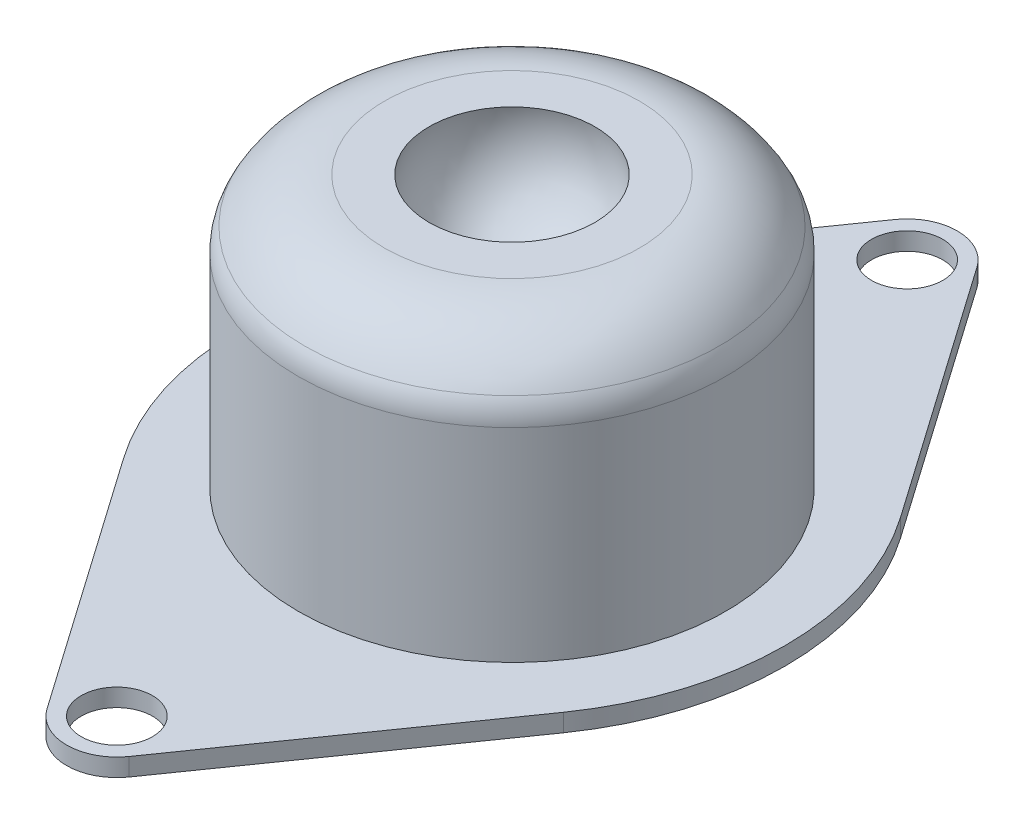
ISO-10303-21;
HEADER;
FILE_DESCRIPTION(('STEP AP214'),'2;1');
FILE_NAME('part.step','',(''),(''),'','','');
FILE_SCHEMA(('AUTOMOTIVE_DESIGN { 1 0 10303 214 1 1 1 1 }'));
ENDSEC;
DATA;
#1=APPLICATION_CONTEXT('core data for automotive mechanical design processes');
#2=APPLICATION_PROTOCOL_DEFINITION('international standard','automotive_design',2000,#1);
#3=PRODUCT_CONTEXT('',#1,'mechanical');
#4=PRODUCT('Part','Part','',(#3));
#5=PRODUCT_RELATED_PRODUCT_CATEGORY('part','',(#4));
#6=PRODUCT_DEFINITION_FORMATION('','',#4);
#7=PRODUCT_DEFINITION_CONTEXT('part definition',#1,'design');
#8=PRODUCT_DEFINITION('design','',#6,#7);
#9=PRODUCT_DEFINITION_SHAPE('','',#8);
#10=(LENGTH_UNIT() NAMED_UNIT(*) SI_UNIT(.MILLI.,.METRE.));
#11=(NAMED_UNIT(*) PLANE_ANGLE_UNIT() SI_UNIT($,.RADIAN.));
#12=(NAMED_UNIT(*) SI_UNIT($,.STERADIAN.) SOLID_ANGLE_UNIT());
#13=UNCERTAINTY_MEASURE_WITH_UNIT(LENGTH_MEASURE(1.E-05),#10,'distance_accuracy_value','');
#14=(GEOMETRIC_REPRESENTATION_CONTEXT(3) GLOBAL_UNCERTAINTY_ASSIGNED_CONTEXT((#13)) GLOBAL_UNIT_ASSIGNED_CONTEXT((#10,
#11,#12)) REPRESENTATION_CONTEXT('',''));
#15=CARTESIAN_POINT('',(0.,0.,0.));
#16=DIRECTION('',(0.,0.,1.));
#17=DIRECTION('',(1.,0.,0.));
#18=AXIS2_PLACEMENT_3D('',#15,#16,#17);
#19=CARTESIAN_POINT('',(0.,1.,-22.1839548103891));
#20=DIRECTION('',(0.,-1.,0.));
#21=DIRECTION('',(0.,0.,-1.));
#22=AXIS2_PLACEMENT_3D('',#19,#20,#21);
#23=CYLINDRICAL_SURFACE('',#22,2.81604518961093);
#24=CARTESIAN_POINT('',(0.,0.,-22.1839548103891));
#25=DIRECTION('',(0.,1.,0.));
#26=DIRECTION('',(0.,0.,-1.));
#27=AXIS2_PLACEMENT_3D('',#24,#25,#26);
#28=CIRCLE('',#27,2.81604518961093);
#29=CARTESIAN_POINT('',(2.30676917387997,0.,-23.7991719748496));
#30=VERTEX_POINT('',#29);
#31=CARTESIAN_POINT('',(-2.30676917387997,0.,-23.7991719748496));
#32=VERTEX_POINT('',#31);
#33=EDGE_CURVE('E131',#30,#32,#28,.T.);
#34=ORIENTED_EDGE('',*,*,#33,.T.);
#35=DIRECTION('',(0.,-1.,0.));
#36=VECTOR('',#35,1.);
#37=CARTESIAN_POINT('',(-2.30676917387997,1.,-23.7991719748496));
#38=LINE('',#37,#36);
#39=CARTESIAN_POINT('',(-2.30676917387997,1.,-23.7991719748496));
#40=VERTEX_POINT('',#39);
#41=EDGE_CURVE('E159',#40,#32,#38,.T.);
#42=ORIENTED_EDGE('',*,*,#41,.F.);
#43=CARTESIAN_POINT('',(0.,1.,-22.1839548103891));
#44=DIRECTION('',(0.,1.,0.));
#45=DIRECTION('',(0.,0.,-1.));
#46=AXIS2_PLACEMENT_3D('',#43,#44,#45);
#47=CIRCLE('',#46,2.81604518961093);
#48=CARTESIAN_POINT('',(2.30676917387997,1.,-23.7991719748496));
#49=VERTEX_POINT('',#48);
#50=EDGE_CURVE('E146',#49,#40,#47,.T.);
#51=ORIENTED_EDGE('',*,*,#50,.F.);
#52=DIRECTION('',(0.,-1.,0.));
#53=VECTOR('',#52,1.);
#54=CARTESIAN_POINT('',(2.30676917387997,1.,-23.7991719748496));
#55=LINE('',#54,#53);
#56=EDGE_CURVE('E127',#49,#30,#55,.T.);
#57=ORIENTED_EDGE('',*,*,#56,.T.);
#58=EDGE_LOOP('',(#34,#42,#51,#57));
#59=FACE_BOUND('',#58,.T.);
#60=ADVANCED_FACE('F33',(#59),#23,.T.);
#61=CARTESIAN_POINT('',(-2.30676917387997,1.,-23.7991719748496));
#62=DIRECTION('',(0.819152044288991,0.,0.573576436351047));
#63=DIRECTION('',(0.573576436351047,0.,-0.819152044288991));
#64=AXIS2_PLACEMENT_3D('',#61,#62,#63);
#65=PLANE('',#64);
#66=DIRECTION('',(-0.573576436351047,0.,0.819152044288991));
#67=VECTOR('',#66,1.);
#68=CARTESIAN_POINT('',(-2.30676917387997,0.,-23.7991719748496));
#69=LINE('',#68,#67);
#70=CARTESIAN_POINT('',(-12.3443568100233,0.,-9.46401119979229));
#71=VERTEX_POINT('',#70);
#72=EDGE_CURVE('E134',#32,#71,#69,.T.);
#73=ORIENTED_EDGE('',*,*,#72,.T.);
#74=DIRECTION('',(0.,-1.,0.));
#75=VECTOR('',#74,1.);
#76=CARTESIAN_POINT('',(-12.3443568100233,1.,-9.46401119979229));
#77=LINE('',#76,#75);
#78=CARTESIAN_POINT('',(-12.3443568100233,1.,-9.46401119979229));
#79=VERTEX_POINT('',#78);
#80=EDGE_CURVE('E156',#79,#71,#77,.T.);
#81=ORIENTED_EDGE('',*,*,#80,.F.);
#82=DIRECTION('',(-0.573576436351047,0.,0.819152044288991));
#83=VECTOR('',#82,1.);
#84=CARTESIAN_POINT('',(-2.30676917387997,1.,-23.7991719748496));
#85=LINE('',#84,#83);
#86=EDGE_CURVE('E94',#40,#79,#85,.T.);
#87=ORIENTED_EDGE('',*,*,#86,.F.);
#88=ORIENTED_EDGE('',*,*,#41,.T.);
#89=EDGE_LOOP('',(#73,#81,#87,#88));
#90=FACE_BOUND('',#89,.T.);
#91=ADVANCED_FACE('F212',(#90),#65,.F.);
#92=CARTESIAN_POINT('',(1.17165192074506,1.,0.));
#93=DIRECTION('',(0.,-1.,0.));
#94=DIRECTION('',(0.,0.,-1.));
#95=AXIS2_PLACEMENT_3D('',#92,#93,#94);
#96=CYLINDRICAL_SURFACE('',#95,16.5);
#97=CARTESIAN_POINT('',(1.17165192074506,0.,0.));
#98=DIRECTION('',(0.,1.,0.));
#99=DIRECTION('',(0.,0.,1.));
#100=AXIS2_PLACEMENT_3D('',#97,#98,#99);
#101=CIRCLE('',#100,16.5);
#102=CARTESIAN_POINT('',(-12.3443568100233,0.,9.46401119979227));
#103=VERTEX_POINT('',#102);
#104=EDGE_CURVE('E137',#71,#103,#101,.T.);
#105=ORIENTED_EDGE('',*,*,#104,.T.);
#106=DIRECTION('',(0.,-1.,0.));
#107=VECTOR('',#106,1.);
#108=CARTESIAN_POINT('',(-12.3443568100233,1.,9.46401119979227));
#109=LINE('',#108,#107);
#110=CARTESIAN_POINT('',(-12.3443568100233,1.,9.46401119979227));
#111=VERTEX_POINT('',#110);
#112=EDGE_CURVE('E153',#111,#103,#109,.T.);
#113=ORIENTED_EDGE('',*,*,#112,.F.);
#114=CARTESIAN_POINT('',(1.17165192074506,1.,0.));
#115=DIRECTION('',(0.,1.,0.));
#116=DIRECTION('',(0.,0.,1.));
#117=AXIS2_PLACEMENT_3D('',#114,#115,#116);
#118=CIRCLE('',#117,16.5);
#119=EDGE_CURVE('E180',#79,#111,#118,.T.);
#120=ORIENTED_EDGE('',*,*,#119,.F.);
#121=ORIENTED_EDGE('',*,*,#80,.T.);
#122=EDGE_LOOP('',(#105,#113,#120,#121));
#123=FACE_BOUND('',#122,.T.);
#124=ADVANCED_FACE('F216',(#123),#96,.T.);
#125=CARTESIAN_POINT('',(-2.30676917387997,1.,23.7991719748496));
#126=DIRECTION('',(0.819152044288991,0.,-0.573576436351047));
#127=DIRECTION('',(-0.573576436351047,0.,-0.819152044288991));
#128=AXIS2_PLACEMENT_3D('',#125,#126,#127);
#129=PLANE('',#128);
#130=DIRECTION('',(0.573576436351047,0.,0.819152044288991));
#131=VECTOR('',#130,1.);
#132=CARTESIAN_POINT('',(-2.30676917387997,0.,23.7991719748496));
#133=LINE('',#132,#131);
#134=CARTESIAN_POINT('',(-2.30676917387997,0.,23.7991719748496));
#135=VERTEX_POINT('',#134);
#136=EDGE_CURVE('E139',#103,#135,#133,.T.);
#137=ORIENTED_EDGE('',*,*,#136,.T.);
#138=DIRECTION('',(0.,-1.,0.));
#139=VECTOR('',#138,1.);
#140=CARTESIAN_POINT('',(-2.30676917387997,1.,23.7991719748496));
#141=LINE('',#140,#139);
#142=CARTESIAN_POINT('',(-2.30676917387997,1.,23.7991719748496));
#143=VERTEX_POINT('',#142);
#144=EDGE_CURVE('E150',#143,#135,#141,.T.);
#145=ORIENTED_EDGE('',*,*,#144,.F.);
#146=DIRECTION('',(0.573576436351047,0.,0.819152044288991));
#147=VECTOR('',#146,1.);
#148=CARTESIAN_POINT('',(-2.30676917387997,1.,23.7991719748496));
#149=LINE('',#148,#147);
#150=EDGE_CURVE('E182',#111,#143,#149,.T.);
#151=ORIENTED_EDGE('',*,*,#150,.F.);
#152=ORIENTED_EDGE('',*,*,#112,.T.);
#153=EDGE_LOOP('',(#137,#145,#151,#152));
#154=FACE_BOUND('',#153,.T.);
#155=ADVANCED_FACE('F188',(#154),#129,.F.);
#156=CARTESIAN_POINT('',(0.,1.,22.1839548103891));
#157=DIRECTION('',(0.,-1.,0.));
#158=DIRECTION('',(0.,0.,-1.));
#159=AXIS2_PLACEMENT_3D('',#156,#157,#158);
#160=CYLINDRICAL_SURFACE('',#159,2.81604518961093);
#161=CARTESIAN_POINT('',(0.,0.,22.1839548103891));
#162=DIRECTION('',(0.,1.,0.));
#163=DIRECTION('',(0.,0.,1.));
#164=AXIS2_PLACEMENT_3D('',#161,#162,#163);
#165=CIRCLE('',#164,2.81604518961093);
#166=CARTESIAN_POINT('',(2.30676917387997,0.,23.7991719748496));
#167=VERTEX_POINT('',#166);
#168=EDGE_CURVE('E141',#135,#167,#165,.T.);
#169=ORIENTED_EDGE('',*,*,#168,.T.);
#170=DIRECTION('',(0.,-1.,0.));
#171=VECTOR('',#170,1.);
#172=CARTESIAN_POINT('',(2.30676917387997,1.,23.7991719748496));
#173=LINE('',#172,#171);
#174=CARTESIAN_POINT('',(2.30676917387997,1.,23.7991719748496));
#175=VERTEX_POINT('',#174);
#176=EDGE_CURVE('E122',#175,#167,#173,.T.);
#177=ORIENTED_EDGE('',*,*,#176,.F.);
#178=CARTESIAN_POINT('',(0.,1.,22.1839548103891));
#179=DIRECTION('',(0.,1.,0.));
#180=DIRECTION('',(0.,0.,1.));
#181=AXIS2_PLACEMENT_3D('',#178,#179,#180);
#182=CIRCLE('',#181,2.81604518961093);
#183=EDGE_CURVE('E113',#143,#175,#182,.T.);
#184=ORIENTED_EDGE('',*,*,#183,.F.);
#185=ORIENTED_EDGE('',*,*,#144,.T.);
#186=EDGE_LOOP('',(#169,#177,#184,#185));
#187=FACE_BOUND('',#186,.T.);
#188=ADVANCED_FACE('F192',(#187),#160,.T.);
#189=CARTESIAN_POINT('',(2.30676917387998,1.,23.7991719748496));
#190=DIRECTION('',(-0.819152044288992,0.,-0.573576436351047));
#191=DIRECTION('',(-0.573576436351047,0.,0.819152044288992));
#192=AXIS2_PLACEMENT_3D('',#189,#190,#191);
#193=PLANE('',#192);
#194=DIRECTION('',(0.573576436351047,0.,-0.819152044288992));
#195=VECTOR('',#194,1.);
#196=CARTESIAN_POINT('',(2.30676917387998,0.,23.7991719748496));
#197=LINE('',#196,#195);
#198=CARTESIAN_POINT('',(12.3443568100233,0.,9.46401119979227));
#199=VERTEX_POINT('',#198);
#200=EDGE_CURVE('E121',#167,#199,#197,.T.);
#201=ORIENTED_EDGE('',*,*,#200,.T.);
#202=DIRECTION('',(0.,-1.,0.));
#203=VECTOR('',#202,1.);
#204=CARTESIAN_POINT('',(12.3443568100233,1.,9.46401119979227));
#205=LINE('',#204,#203);
#206=CARTESIAN_POINT('',(12.3443568100233,1.,9.46401119979227));
#207=VERTEX_POINT('',#206);
#208=EDGE_CURVE('E118',#207,#199,#205,.T.);
#209=ORIENTED_EDGE('',*,*,#208,.F.);
#210=DIRECTION('',(0.573576436351047,0.,-0.819152044288992));
#211=VECTOR('',#210,1.);
#212=CARTESIAN_POINT('',(2.30676917387998,1.,23.7991719748496));
#213=LINE('',#212,#211);
#214=EDGE_CURVE('E107',#175,#207,#213,.T.);
#215=ORIENTED_EDGE('',*,*,#214,.F.);
#216=ORIENTED_EDGE('',*,*,#176,.T.);
#217=EDGE_LOOP('',(#201,#209,#215,#216));
#218=FACE_BOUND('',#217,.T.);
#219=ADVANCED_FACE('F119',(#218),#193,.F.);
#220=CARTESIAN_POINT('',(-1.17165192074505,1.,0.));
#221=DIRECTION('',(0.,-1.,0.));
#222=DIRECTION('',(0.,0.,-1.));
#223=AXIS2_PLACEMENT_3D('',#220,#221,#222);
#224=CYLINDRICAL_SURFACE('',#223,16.5);
#225=CARTESIAN_POINT('',(-1.17165192074505,0.,0.));
#226=DIRECTION('',(0.,1.,0.));
#227=DIRECTION('',(0.,0.,-1.));
#228=AXIS2_PLACEMENT_3D('',#225,#226,#227);
#229=CIRCLE('',#228,16.5);
#230=CARTESIAN_POINT('',(12.3443568100233,0.,-9.46401119979229));
#231=VERTEX_POINT('',#230);
#232=EDGE_CURVE('E79',#199,#231,#229,.T.);
#233=ORIENTED_EDGE('',*,*,#232,.T.);
#234=DIRECTION('',(0.,-1.,0.));
#235=VECTOR('',#234,1.);
#236=CARTESIAN_POINT('',(12.3443568100233,1.,-9.46401119979229));
#237=LINE('',#236,#235);
#238=CARTESIAN_POINT('',(12.3443568100233,1.,-9.46401119979229));
#239=VERTEX_POINT('',#238);
#240=EDGE_CURVE('E123',#239,#231,#237,.T.);
#241=ORIENTED_EDGE('',*,*,#240,.F.);
#242=CARTESIAN_POINT('',(-1.17165192074505,1.,0.));
#243=DIRECTION('',(0.,1.,0.));
#244=DIRECTION('',(0.,0.,-1.));
#245=AXIS2_PLACEMENT_3D('',#242,#243,#244);
#246=CIRCLE('',#245,16.5);
#247=EDGE_CURVE('E111',#207,#239,#246,.T.);
#248=ORIENTED_EDGE('',*,*,#247,.F.);
#249=ORIENTED_EDGE('',*,*,#208,.T.);
#250=EDGE_LOOP('',(#233,#241,#248,#249));
#251=FACE_BOUND('',#250,.T.);
#252=ADVANCED_FACE('F125',(#251),#224,.T.);
#253=CARTESIAN_POINT('',(2.30676917387997,1.,-23.7991719748496));
#254=DIRECTION('',(-0.819152044288991,0.,0.573576436351047));
#255=DIRECTION('',(0.573576436351047,0.,0.819152044288991));
#256=AXIS2_PLACEMENT_3D('',#253,#254,#255);
#257=PLANE('',#256);
#258=DIRECTION('',(-0.573576436351047,0.,-0.819152044288991));
#259=VECTOR('',#258,1.);
#260=CARTESIAN_POINT('',(2.30676917387997,0.,-23.7991719748496));
#261=LINE('',#260,#259);
#262=EDGE_CURVE('E85',#231,#30,#261,.T.);
#263=ORIENTED_EDGE('',*,*,#262,.T.);
#264=ORIENTED_EDGE('',*,*,#56,.F.);
#265=DIRECTION('',(-0.573576436351047,0.,-0.819152044288991));
#266=VECTOR('',#265,1.);
#267=CARTESIAN_POINT('',(2.30676917387997,1.,-23.7991719748496));
#268=LINE('',#267,#266);
#269=EDGE_CURVE('E50',#239,#49,#268,.T.);
#270=ORIENTED_EDGE('',*,*,#269,.F.);
#271=ORIENTED_EDGE('',*,*,#240,.T.);
#272=EDGE_LOOP('',(#263,#264,#270,#271));
#273=FACE_BOUND('',#272,.T.);
#274=ADVANCED_FACE('F200',(#273),#257,.F.);
#275=CARTESIAN_POINT('',(0.,1.,-22.1839548103891));
#276=DIRECTION('',(0.,-1.,0.));
#277=DIRECTION('',(0.,0.,-1.));
#278=AXIS2_PLACEMENT_3D('',#275,#276,#277);
#279=PLANE('',#278);
#280=CARTESIAN_POINT('',(0.,1.,22.1839548103891));
#281=DIRECTION('',(0.,1.,0.));
#282=DIRECTION('',(0.,0.,1.));
#283=AXIS2_PLACEMENT_3D('',#280,#281,#282);
#284=CIRCLE('',#283,2.);
#285=CARTESIAN_POINT('',(0.,1.,24.1839548103891));
#286=VERTEX_POINT('',#285);
#287=EDGE_CURVE('E329',#286,#286,#284,.T.);
#288=ORIENTED_EDGE('',*,*,#287,.F.);
#289=EDGE_LOOP('',(#288));
#290=FACE_BOUND('',#289,.T.);
#291=CARTESIAN_POINT('',(0.,1.,-22.1839548103891));
#292=DIRECTION('',(0.,1.,0.));
#293=DIRECTION('',(0.,0.,1.));
#294=AXIS2_PLACEMENT_3D('',#291,#292,#293);
#295=CIRCLE('',#294,2.);
#296=CARTESIAN_POINT('',(0.,1.,-20.1839548103891));
#297=VERTEX_POINT('',#296);
#298=EDGE_CURVE('E170',#297,#297,#295,.T.);
#299=ORIENTED_EDGE('',*,*,#298,.F.);
#300=EDGE_LOOP('',(#299));
#301=FACE_BOUND('',#300,.T.);
#302=CARTESIAN_POINT('',(0.,1.,0.));
#303=DIRECTION('',(0.,1.,0.));
#304=DIRECTION('',(0.,0.,1.));
#305=AXIS2_PLACEMENT_3D('',#302,#303,#304);
#306=CIRCLE('',#305,12.);
#307=CARTESIAN_POINT('',(0.,1.,12.));
#308=VERTEX_POINT('',#307);
#309=EDGE_CURVE('E160',#308,#308,#306,.T.);
#310=ORIENTED_EDGE('',*,*,#309,.F.);
#311=EDGE_LOOP('',(#310));
#312=FACE_BOUND('',#311,.T.);
#313=ORIENTED_EDGE('',*,*,#50,.T.);
#314=ORIENTED_EDGE('',*,*,#86,.T.);
#315=ORIENTED_EDGE('',*,*,#119,.T.);
#316=ORIENTED_EDGE('',*,*,#150,.T.);
#317=ORIENTED_EDGE('',*,*,#183,.T.);
#318=ORIENTED_EDGE('',*,*,#214,.T.);
#319=ORIENTED_EDGE('',*,*,#247,.T.);
#320=ORIENTED_EDGE('',*,*,#269,.T.);
#321=EDGE_LOOP('',(#313,#314,#315,#316,#317,#318,#319,#320));
#322=FACE_BOUND('',#321,.T.);
#323=ADVANCED_FACE('F109',(#290,#301,#312,#322),#279,.F.);
#324=CARTESIAN_POINT('',(0.,0.,-22.1839548103891));
#325=DIRECTION('',(0.,-1.,0.));
#326=DIRECTION('',(0.,0.,-1.));
#327=AXIS2_PLACEMENT_3D('',#324,#325,#326);
#328=PLANE('',#327);
#329=CARTESIAN_POINT('',(0.,0.,22.1839548103891));
#330=DIRECTION('',(0.,1.,0.));
#331=DIRECTION('',(0.,0.,1.));
#332=AXIS2_PLACEMENT_3D('',#329,#330,#331);
#333=CIRCLE('',#332,2.);
#334=CARTESIAN_POINT('',(0.,0.,24.1839548103891));
#335=VERTEX_POINT('',#334);
#336=EDGE_CURVE('E175',#335,#335,#333,.T.);
#337=ORIENTED_EDGE('',*,*,#336,.T.);
#338=EDGE_LOOP('',(#337));
#339=FACE_BOUND('',#338,.T.);
#340=CARTESIAN_POINT('',(0.,0.,-22.1839548103891));
#341=DIRECTION('',(0.,1.,0.));
#342=DIRECTION('',(0.,0.,1.));
#343=AXIS2_PLACEMENT_3D('',#340,#341,#342);
#344=CIRCLE('',#343,2.);
#345=CARTESIAN_POINT('',(0.,0.,-20.1839548103891));
#346=VERTEX_POINT('',#345);
#347=EDGE_CURVE('E330',#346,#346,#344,.T.);
#348=ORIENTED_EDGE('',*,*,#347,.T.);
#349=EDGE_LOOP('',(#348));
#350=FACE_BOUND('',#349,.T.);
#351=ORIENTED_EDGE('',*,*,#33,.F.);
#352=ORIENTED_EDGE('',*,*,#262,.F.);
#353=ORIENTED_EDGE('',*,*,#232,.F.);
#354=ORIENTED_EDGE('',*,*,#200,.F.);
#355=ORIENTED_EDGE('',*,*,#168,.F.);
#356=ORIENTED_EDGE('',*,*,#136,.F.);
#357=ORIENTED_EDGE('',*,*,#104,.F.);
#358=ORIENTED_EDGE('',*,*,#72,.F.);
#359=EDGE_LOOP('',(#351,#352,#353,#354,#355,#356,#357,#358));
#360=FACE_BOUND('',#359,.T.);
#361=ADVANCED_FACE('F195',(#339,#350,#360),#328,.T.);
#362=CARTESIAN_POINT('',(0.,15.2375,0.));
#363=DIRECTION('',(0.,1.,0.));
#364=DIRECTION('',(1.,0.,0.));
#365=AXIS2_PLACEMENT_3D('',#362,#363,#364);
#366=SPHERICAL_SURFACE('',#365,4.7625);
#367=CARTESIAN_POINT('',(0.,16.2375,0.));
#368=DIRECTION('',(0.,1.,0.));
#369=DIRECTION('',(0.,0.,1.));
#370=AXIS2_PLACEMENT_3D('',#367,#368,#369);
#371=CIRCLE('',#370,4.65632969730452);
#372=CARTESIAN_POINT('',(0.,16.2375,4.65632969730452));
#373=VERTEX_POINT('',#372);
#374=EDGE_CURVE('E135',#373,#373,#371,.T.);
#375=ORIENTED_EDGE('',*,*,#374,.T.);
#376=EDGE_LOOP('',(#375));
#377=FACE_BOUND('',#376,.T.);
#378=ADVANCED_FACE('F245',(#377),#366,.F.);
#379=CARTESIAN_POINT('',(7.15632969730452,16.2375,0.));
#380=DIRECTION('',(0.,-1.,0.));
#381=DIRECTION('',(0.,0.,-1.));
#382=AXIS2_PLACEMENT_3D('',#379,#380,#381);
#383=PLANE('',#382);
#384=ORIENTED_EDGE('',*,*,#374,.F.);
#385=EDGE_LOOP('',(#384));
#386=FACE_BOUND('',#385,.T.);
#387=CARTESIAN_POINT('',(0.,16.2375,0.));
#388=DIRECTION('',(0.,1.,0.));
#389=DIRECTION('',(0.,0.,1.));
#390=AXIS2_PLACEMENT_3D('',#387,#388,#389);
#391=CIRCLE('',#390,7.15632969730452);
#392=CARTESIAN_POINT('',(0.,16.2375,7.15632969730452));
#393=VERTEX_POINT('',#392);
#394=EDGE_CURVE('E172',#393,#393,#391,.T.);
#395=ORIENTED_EDGE('',*,*,#394,.T.);
#396=EDGE_LOOP('',(#395));
#397=FACE_BOUND('',#396,.T.);
#398=ADVANCED_FACE('F250',(#386,#397),#383,.F.);
#399=CARTESIAN_POINT('',(0.,10.9954076059901,0.));
#400=DIRECTION('',(0.,1.,0.));
#401=DIRECTION('',(0.,0.,1.));
#402=AXIS2_PLACEMENT_3D('',#399,#400,#401);
#403=TOROIDAL_SURFACE('',#402,7.15632969730452,5.2420923940099);
#404=CARTESIAN_POINT('',(0.,13.7166820211627,0.));
#405=DIRECTION('',(0.,-1.,0.));
#406=DIRECTION('',(0.,0.,-1.));
#407=AXIS2_PLACEMENT_3D('',#404,#405,#406);
#408=CIRCLE('',#407,11.6367535862534);
#409=CARTESIAN_POINT('',(0.,13.7166820211627,-11.6367535862534));
#410=VERTEX_POINT('',#409);
#411=EDGE_CURVE('E42',#410,#410,#408,.F.);
#412=ORIENTED_EDGE('',*,*,#411,.T.);
#413=EDGE_LOOP('',(#412));
#414=FACE_BOUND('',#413,.T.);
#415=ORIENTED_EDGE('',*,*,#394,.F.);
#416=EDGE_LOOP('',(#415));
#417=FACE_BOUND('',#416,.T.);
#418=ADVANCED_FACE('F262',(#414,#417),#403,.T.);
#419=CARTESIAN_POINT('',(0.,10.475,0.));
#420=DIRECTION('',(0.,1.,0.));
#421=DIRECTION('',(0.,0.,1.));
#422=AXIS2_PLACEMENT_3D('',#419,#420,#421);
#423=CYLINDRICAL_SURFACE('',#422,12.);
#424=CARTESIAN_POINT('',(0.,12.4188823017786,0.));
#425=DIRECTION('',(0.,-1.,0.));
#426=DIRECTION('',(0.,0.,-1.));
#427=AXIS2_PLACEMENT_3D('',#424,#425,#426);
#428=CIRCLE('',#427,12.);
#429=CARTESIAN_POINT('',(0.,12.4188823017786,-12.));
#430=VERTEX_POINT('',#429);
#431=EDGE_CURVE('E11',#430,#430,#428,.T.);
#432=ORIENTED_EDGE('',*,*,#431,.T.);
#433=EDGE_LOOP('',(#432));
#434=FACE_BOUND('',#433,.T.);
#435=ORIENTED_EDGE('',*,*,#309,.T.);
#436=EDGE_LOOP('',(#435));
#437=FACE_BOUND('',#436,.T.);
#438=ADVANCED_FACE('F272',(#434,#437),#423,.T.);
#439=CARTESIAN_POINT('',(0.,12.4188823017786,0.));
#440=DIRECTION('',(0.,-1.,0.));
#441=DIRECTION('',(0.,0.,-1.));
#442=AXIS2_PLACEMENT_3D('',#439,#440,#441);
#443=TOROIDAL_SURFACE('',#442,9.5,2.5);
#444=ORIENTED_EDGE('',*,*,#431,.F.);
#445=EDGE_LOOP('',(#444));
#446=FACE_BOUND('',#445,.T.);
#447=ORIENTED_EDGE('',*,*,#411,.F.);
#448=EDGE_LOOP('',(#447));
#449=FACE_BOUND('',#448,.T.);
#450=ADVANCED_FACE('F35',(#446,#449),#443,.T.);
#451=CARTESIAN_POINT('',(0.,0.,-22.1839548103891));
#452=DIRECTION('',(0.,1.,0.));
#453=DIRECTION('',(0.,0.,1.));
#454=AXIS2_PLACEMENT_3D('',#451,#452,#453);
#455=CYLINDRICAL_SURFACE('',#454,2.);
#456=ORIENTED_EDGE('',*,*,#347,.F.);
#457=EDGE_LOOP('',(#456));
#458=FACE_BOUND('',#457,.T.);
#459=ORIENTED_EDGE('',*,*,#298,.T.);
#460=EDGE_LOOP('',(#459));
#461=FACE_BOUND('',#460,.T.);
#462=ADVANCED_FACE('F290',(#458,#461),#455,.F.);
#463=CARTESIAN_POINT('',(0.,0.,22.1839548103891));
#464=DIRECTION('',(0.,1.,0.));
#465=DIRECTION('',(0.,0.,1.));
#466=AXIS2_PLACEMENT_3D('',#463,#464,#465);
#467=CYLINDRICAL_SURFACE('',#466,2.);
#468=ORIENTED_EDGE('',*,*,#336,.F.);
#469=EDGE_LOOP('',(#468));
#470=FACE_BOUND('',#469,.T.);
#471=ORIENTED_EDGE('',*,*,#287,.T.);
#472=EDGE_LOOP('',(#471));
#473=FACE_BOUND('',#472,.T.);
#474=ADVANCED_FACE('F310',(#470,#473),#467,.F.);
#475=CLOSED_SHELL('',(#60,#91,#124,#155,#188,#219,#252,#274,#323,#361,#378,#398,#418,#438,#450,
#462,#474));
#476=MANIFOLD_SOLID_BREP('B2',#475);
#477=ADVANCED_BREP_SHAPE_REPRESENTATION('',(#18,#476),#14);
#478=SHAPE_DEFINITION_REPRESENTATION(#9,#477);
ENDSEC;
END-ISO-10303-21;
